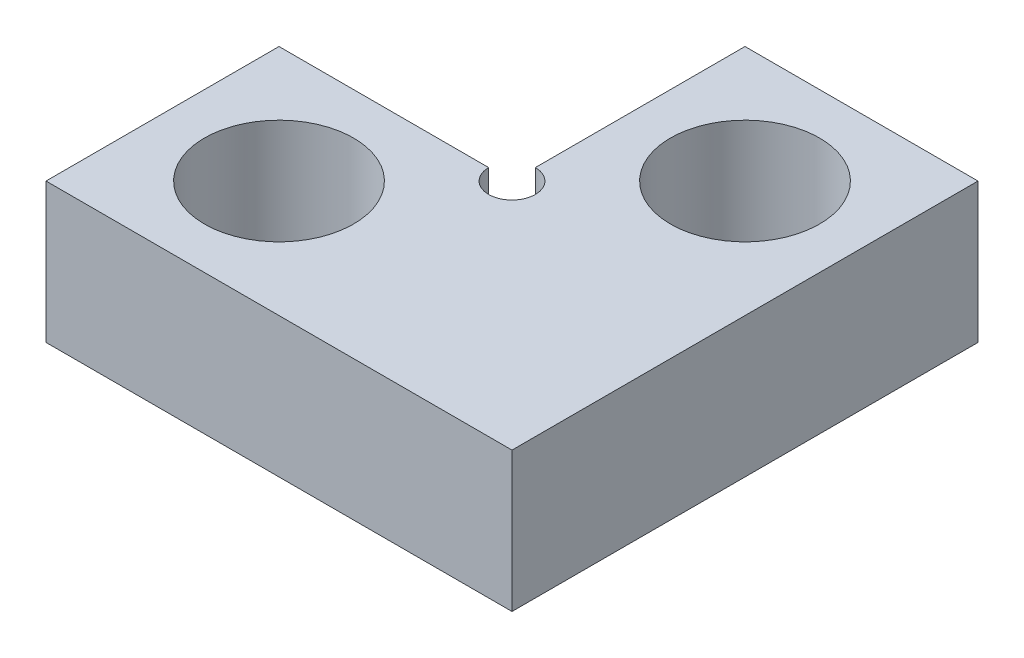
ISO-10303-21;
HEADER;
FILE_DESCRIPTION(('STEP AP214'),'2;1');
FILE_NAME('part.step','',(''),(''),'','','');
FILE_SCHEMA(('AUTOMOTIVE_DESIGN { 1 0 10303 214 1 1 1 1 }'));
ENDSEC;
DATA;
#1=APPLICATION_CONTEXT('core data for automotive mechanical design processes');
#2=APPLICATION_PROTOCOL_DEFINITION('international standard','automotive_design',2000,#1);
#3=PRODUCT_CONTEXT('',#1,'mechanical');
#4=PRODUCT('Part','Part','',(#3));
#5=PRODUCT_RELATED_PRODUCT_CATEGORY('part','',(#4));
#6=PRODUCT_DEFINITION_FORMATION('','',#4);
#7=PRODUCT_DEFINITION_CONTEXT('part definition',#1,'design');
#8=PRODUCT_DEFINITION('design','',#6,#7);
#9=PRODUCT_DEFINITION_SHAPE('','',#8);
#10=(LENGTH_UNIT() NAMED_UNIT(*) SI_UNIT(.MILLI.,.METRE.));
#11=(NAMED_UNIT(*) PLANE_ANGLE_UNIT() SI_UNIT($,.RADIAN.));
#12=(NAMED_UNIT(*) SI_UNIT($,.STERADIAN.) SOLID_ANGLE_UNIT());
#13=UNCERTAINTY_MEASURE_WITH_UNIT(LENGTH_MEASURE(1.E-05),#10,'distance_accuracy_value','');
#14=(GEOMETRIC_REPRESENTATION_CONTEXT(3) GLOBAL_UNCERTAINTY_ASSIGNED_CONTEXT((#13)) GLOBAL_UNIT_ASSIGNED_CONTEXT((#10,
#11,#12)) REPRESENTATION_CONTEXT('',''));
#15=CARTESIAN_POINT('',(0.,0.,0.));
#16=DIRECTION('',(0.,0.,1.));
#17=DIRECTION('',(1.,0.,0.));
#18=AXIS2_PLACEMENT_3D('',#15,#16,#17);
#19=CARTESIAN_POINT('',(0.,3.,0.));
#20=DIRECTION('',(-1.,0.,0.));
#21=DIRECTION('',(0.,0.,1.));
#22=AXIS2_PLACEMENT_3D('',#19,#20,#21);
#23=PLANE('',#22);
#24=DIRECTION('',(0.,0.,-1.));
#25=VECTOR('',#24,1.);
#26=CARTESIAN_POINT('',(0.,0.,0.));
#27=LINE('',#26,#25);
#28=CARTESIAN_POINT('',(0.,0.,-0.5));
#29=VERTEX_POINT('',#28);
#30=CARTESIAN_POINT('',(0.,0.,-5.));
#31=VERTEX_POINT('',#30);
#32=EDGE_CURVE('E130',#29,#31,#27,.T.);
#33=ORIENTED_EDGE('',*,*,#32,.F.);
#34=DIRECTION('',(0.,-1.,0.));
#35=VECTOR('',#34,1.);
#36=CARTESIAN_POINT('',(0.,3.,-0.5));
#37=LINE('',#36,#35);
#38=CARTESIAN_POINT('',(0.,3.,-0.5));
#39=VERTEX_POINT('',#38);
#40=EDGE_CURVE('E11',#39,#29,#37,.T.);
#41=ORIENTED_EDGE('',*,*,#40,.F.);
#42=DIRECTION('',(0.,0.,-1.));
#43=VECTOR('',#42,1.);
#44=CARTESIAN_POINT('',(0.,3.,0.));
#45=LINE('',#44,#43);
#46=CARTESIAN_POINT('',(0.,3.,-5.));
#47=VERTEX_POINT('',#46);
#48=EDGE_CURVE('E168',#39,#47,#45,.T.);
#49=ORIENTED_EDGE('',*,*,#48,.T.);
#50=DIRECTION('',(0.,-1.,0.));
#51=VECTOR('',#50,1.);
#52=CARTESIAN_POINT('',(0.,3.,-5.));
#53=LINE('',#52,#51);
#54=EDGE_CURVE('E52',#47,#31,#53,.T.);
#55=ORIENTED_EDGE('',*,*,#54,.T.);
#56=EDGE_LOOP('',(#33,#41,#49,#55));
#57=FACE_BOUND('',#56,.T.);
#58=ADVANCED_FACE('F35',(#57),#23,.T.);
#59=CARTESIAN_POINT('',(0.,3.,0.));
#60=DIRECTION('',(0.,-1.,0.));
#61=DIRECTION('',(0.,0.,-1.));
#62=AXIS2_PLACEMENT_3D('',#59,#60,#61);
#63=CYLINDRICAL_SURFACE('',#62,0.5);
#64=CARTESIAN_POINT('',(0.,0.,0.));
#65=DIRECTION('',(0.,1.,0.));
#66=DIRECTION('',(0.,0.,1.));
#67=AXIS2_PLACEMENT_3D('',#64,#65,#66);
#68=CIRCLE('',#67,0.5);
#69=CARTESIAN_POINT('',(-0.5,0.,0.));
#70=VERTEX_POINT('',#69);
#71=EDGE_CURVE('E132',#29,#70,#68,.F.);
#72=ORIENTED_EDGE('',*,*,#71,.T.);
#73=DIRECTION('',(0.,-1.,0.));
#74=VECTOR('',#73,1.);
#75=CARTESIAN_POINT('',(-0.5,3.,0.));
#76=LINE('',#75,#74);
#77=CARTESIAN_POINT('',(-0.5,3.,0.));
#78=VERTEX_POINT('',#77);
#79=EDGE_CURVE('E44',#78,#70,#76,.T.);
#80=ORIENTED_EDGE('',*,*,#79,.F.);
#81=CARTESIAN_POINT('',(0.,3.,0.));
#82=DIRECTION('',(0.,1.,0.));
#83=DIRECTION('',(0.,0.,1.));
#84=AXIS2_PLACEMENT_3D('',#81,#82,#83);
#85=CIRCLE('',#84,0.5);
#86=EDGE_CURVE('E166',#39,#78,#85,.F.);
#87=ORIENTED_EDGE('',*,*,#86,.F.);
#88=ORIENTED_EDGE('',*,*,#40,.T.);
#89=EDGE_LOOP('',(#72,#80,#87,#88));
#90=FACE_BOUND('',#89,.T.);
#91=ADVANCED_FACE('F160',(#90),#63,.F.);
#92=CARTESIAN_POINT('',(0.,3.,0.));
#93=DIRECTION('',(0.,0.,-1.));
#94=DIRECTION('',(-1.,0.,0.));
#95=AXIS2_PLACEMENT_3D('',#92,#93,#94);
#96=PLANE('',#95);
#97=DIRECTION('',(1.,0.,0.));
#98=VECTOR('',#97,1.);
#99=CARTESIAN_POINT('',(0.,0.,0.));
#100=LINE('',#99,#98);
#101=CARTESIAN_POINT('',(-5.,0.,0.));
#102=VERTEX_POINT('',#101);
#103=EDGE_CURVE('E135',#102,#70,#100,.T.);
#104=ORIENTED_EDGE('',*,*,#103,.F.);
#105=DIRECTION('',(0.,-1.,0.));
#106=VECTOR('',#105,1.);
#107=CARTESIAN_POINT('',(-5.,3.,0.));
#108=LINE('',#107,#106);
#109=CARTESIAN_POINT('',(-5.,3.,0.));
#110=VERTEX_POINT('',#109);
#111=EDGE_CURVE('E151',#110,#102,#108,.T.);
#112=ORIENTED_EDGE('',*,*,#111,.F.);
#113=DIRECTION('',(1.,0.,0.));
#114=VECTOR('',#113,1.);
#115=CARTESIAN_POINT('',(0.,3.,0.));
#116=LINE('',#115,#114);
#117=EDGE_CURVE('E157',#110,#78,#116,.T.);
#118=ORIENTED_EDGE('',*,*,#117,.T.);
#119=ORIENTED_EDGE('',*,*,#79,.T.);
#120=EDGE_LOOP('',(#104,#112,#118,#119));
#121=FACE_BOUND('',#120,.T.);
#122=ADVANCED_FACE('F156',(#121),#96,.T.);
#123=CARTESIAN_POINT('',(-5.,3.,0.));
#124=DIRECTION('',(-1.,0.,0.));
#125=DIRECTION('',(0.,0.,1.));
#126=AXIS2_PLACEMENT_3D('',#123,#124,#125);
#127=PLANE('',#126);
#128=DIRECTION('',(0.,0.,-1.));
#129=VECTOR('',#128,1.);
#130=CARTESIAN_POINT('',(-5.,0.,0.));
#131=LINE('',#130,#129);
#132=CARTESIAN_POINT('',(-5.,0.,5.));
#133=VERTEX_POINT('',#132);
#134=EDGE_CURVE('E138',#133,#102,#131,.T.);
#135=ORIENTED_EDGE('',*,*,#134,.F.);
#136=DIRECTION('',(0.,-1.,0.));
#137=VECTOR('',#136,1.);
#138=CARTESIAN_POINT('',(-5.,3.,5.));
#139=LINE('',#138,#137);
#140=CARTESIAN_POINT('',(-5.,3.,5.));
#141=VERTEX_POINT('',#140);
#142=EDGE_CURVE('E105',#141,#133,#139,.T.);
#143=ORIENTED_EDGE('',*,*,#142,.F.);
#144=DIRECTION('',(0.,0.,-1.));
#145=VECTOR('',#144,1.);
#146=CARTESIAN_POINT('',(-5.,3.,0.));
#147=LINE('',#146,#145);
#148=EDGE_CURVE('E116',#141,#110,#147,.T.);
#149=ORIENTED_EDGE('',*,*,#148,.T.);
#150=ORIENTED_EDGE('',*,*,#111,.T.);
#151=EDGE_LOOP('',(#135,#143,#149,#150));
#152=FACE_BOUND('',#151,.T.);
#153=ADVANCED_FACE('F165',(#152),#127,.T.);
#154=CARTESIAN_POINT('',(0.,3.,5.));
#155=DIRECTION('',(0.,0.,1.));
#156=DIRECTION('',(1.,0.,0.));
#157=AXIS2_PLACEMENT_3D('',#154,#155,#156);
#158=PLANE('',#157);
#159=DIRECTION('',(-1.,0.,0.));
#160=VECTOR('',#159,1.);
#161=CARTESIAN_POINT('',(0.,0.,5.));
#162=LINE('',#161,#160);
#163=CARTESIAN_POINT('',(5.,0.,5.));
#164=VERTEX_POINT('',#163);
#165=EDGE_CURVE('E101',#164,#133,#162,.T.);
#166=ORIENTED_EDGE('',*,*,#165,.F.);
#167=DIRECTION('',(0.,-1.,0.));
#168=VECTOR('',#167,1.);
#169=CARTESIAN_POINT('',(5.,3.,5.));
#170=LINE('',#169,#168);
#171=CARTESIAN_POINT('',(5.,3.,5.));
#172=VERTEX_POINT('',#171);
#173=EDGE_CURVE('E96',#172,#164,#170,.T.);
#174=ORIENTED_EDGE('',*,*,#173,.F.);
#175=DIRECTION('',(-1.,0.,0.));
#176=VECTOR('',#175,1.);
#177=CARTESIAN_POINT('',(0.,3.,5.));
#178=LINE('',#177,#176);
#179=EDGE_CURVE('E99',#172,#141,#178,.T.);
#180=ORIENTED_EDGE('',*,*,#179,.T.);
#181=ORIENTED_EDGE('',*,*,#142,.T.);
#182=EDGE_LOOP('',(#166,#174,#180,#181));
#183=FACE_BOUND('',#182,.T.);
#184=ADVANCED_FACE('F98',(#183),#158,.T.);
#185=CARTESIAN_POINT('',(5.,3.,0.));
#186=DIRECTION('',(1.,0.,0.));
#187=DIRECTION('',(0.,0.,-1.));
#188=AXIS2_PLACEMENT_3D('',#185,#186,#187);
#189=PLANE('',#188);
#190=DIRECTION('',(0.,0.,1.));
#191=VECTOR('',#190,1.);
#192=CARTESIAN_POINT('',(5.,0.,0.));
#193=LINE('',#192,#191);
#194=CARTESIAN_POINT('',(5.,0.,-5.));
#195=VERTEX_POINT('',#194);
#196=EDGE_CURVE('E142',#195,#164,#193,.T.);
#197=ORIENTED_EDGE('',*,*,#196,.F.);
#198=DIRECTION('',(0.,-1.,0.));
#199=VECTOR('',#198,1.);
#200=CARTESIAN_POINT('',(5.,3.,-5.));
#201=LINE('',#200,#199);
#202=CARTESIAN_POINT('',(5.,3.,-5.));
#203=VERTEX_POINT('',#202);
#204=EDGE_CURVE('E74',#203,#195,#201,.T.);
#205=ORIENTED_EDGE('',*,*,#204,.F.);
#206=DIRECTION('',(0.,0.,1.));
#207=VECTOR('',#206,1.);
#208=CARTESIAN_POINT('',(5.,3.,0.));
#209=LINE('',#208,#207);
#210=EDGE_CURVE('E113',#203,#172,#209,.T.);
#211=ORIENTED_EDGE('',*,*,#210,.T.);
#212=ORIENTED_EDGE('',*,*,#173,.T.);
#213=EDGE_LOOP('',(#197,#205,#211,#212));
#214=FACE_BOUND('',#213,.T.);
#215=ADVANCED_FACE('F118',(#214),#189,.T.);
#216=CARTESIAN_POINT('',(2.5,3.,-2.5));
#217=DIRECTION('',(0.,-1.,0.));
#218=DIRECTION('',(0.,0.,-1.));
#219=AXIS2_PLACEMENT_3D('',#216,#217,#218);
#220=CYLINDRICAL_SURFACE('',#219,1.6);
#221=CARTESIAN_POINT('',(2.5,3.,-2.5));
#222=DIRECTION('',(0.,1.,0.));
#223=DIRECTION('',(0.,0.,1.));
#224=AXIS2_PLACEMENT_3D('',#221,#222,#223);
#225=CIRCLE('',#224,1.6);
#226=CARTESIAN_POINT('',(2.5,3.,-0.9));
#227=VERTEX_POINT('',#226);
#228=EDGE_CURVE('E172',#227,#227,#225,.T.);
#229=ORIENTED_EDGE('',*,*,#228,.T.);
#230=EDGE_LOOP('',(#229));
#231=FACE_BOUND('',#230,.T.);
#232=CARTESIAN_POINT('',(2.5,0.,-2.5));
#233=DIRECTION('',(0.,1.,0.));
#234=DIRECTION('',(0.,0.,1.));
#235=AXIS2_PLACEMENT_3D('',#232,#233,#234);
#236=CIRCLE('',#235,1.6);
#237=CARTESIAN_POINT('',(2.5,0.,-0.9));
#238=VERTEX_POINT('',#237);
#239=EDGE_CURVE('E127',#238,#238,#236,.T.);
#240=ORIENTED_EDGE('',*,*,#239,.F.);
#241=EDGE_LOOP('',(#240));
#242=FACE_BOUND('',#241,.T.);
#243=ADVANCED_FACE('F186',(#231,#242),#220,.F.);
#244=CARTESIAN_POINT('',(-2.5,3.,2.5));
#245=DIRECTION('',(0.,-1.,0.));
#246=DIRECTION('',(0.,0.,-1.));
#247=AXIS2_PLACEMENT_3D('',#244,#245,#246);
#248=CYLINDRICAL_SURFACE('',#247,1.6);
#249=CARTESIAN_POINT('',(-2.5,3.,2.5));
#250=DIRECTION('',(0.,1.,0.));
#251=DIRECTION('',(0.,0.,1.));
#252=AXIS2_PLACEMENT_3D('',#249,#250,#251);
#253=CIRCLE('',#252,1.6);
#254=CARTESIAN_POINT('',(-2.5,3.,4.1));
#255=VERTEX_POINT('',#254);
#256=EDGE_CURVE('E147',#255,#255,#253,.T.);
#257=ORIENTED_EDGE('',*,*,#256,.T.);
#258=EDGE_LOOP('',(#257));
#259=FACE_BOUND('',#258,.T.);
#260=CARTESIAN_POINT('',(-2.5,0.,2.5));
#261=DIRECTION('',(0.,1.,0.));
#262=DIRECTION('',(0.,0.,1.));
#263=AXIS2_PLACEMENT_3D('',#260,#261,#262);
#264=CIRCLE('',#263,1.6);
#265=CARTESIAN_POINT('',(-2.5,0.,4.1));
#266=VERTEX_POINT('',#265);
#267=EDGE_CURVE('E124',#266,#266,#264,.T.);
#268=ORIENTED_EDGE('',*,*,#267,.F.);
#269=EDGE_LOOP('',(#268));
#270=FACE_BOUND('',#269,.T.);
#271=ADVANCED_FACE('F37',(#259,#270),#248,.F.);
#272=CARTESIAN_POINT('',(0.,3.,-5.));
#273=DIRECTION('',(0.,0.,-1.));
#274=DIRECTION('',(-1.,0.,0.));
#275=AXIS2_PLACEMENT_3D('',#272,#273,#274);
#276=PLANE('',#275);
#277=DIRECTION('',(1.,0.,0.));
#278=VECTOR('',#277,1.);
#279=CARTESIAN_POINT('',(0.,0.,-5.));
#280=LINE('',#279,#278);
#281=EDGE_CURVE('E144',#31,#195,#280,.T.);
#282=ORIENTED_EDGE('',*,*,#281,.F.);
#283=ORIENTED_EDGE('',*,*,#54,.F.);
#284=DIRECTION('',(1.,0.,0.));
#285=VECTOR('',#284,1.);
#286=CARTESIAN_POINT('',(0.,3.,-5.));
#287=LINE('',#286,#285);
#288=EDGE_CURVE('E119',#47,#203,#287,.T.);
#289=ORIENTED_EDGE('',*,*,#288,.T.);
#290=ORIENTED_EDGE('',*,*,#204,.T.);
#291=EDGE_LOOP('',(#282,#283,#289,#290));
#292=FACE_BOUND('',#291,.T.);
#293=ADVANCED_FACE('F182',(#292),#276,.T.);
#294=CARTESIAN_POINT('',(0.,3.,0.));
#295=DIRECTION('',(0.,1.,0.));
#296=DIRECTION('',(0.,0.,1.));
#297=AXIS2_PLACEMENT_3D('',#294,#295,#296);
#298=PLANE('',#297);
#299=ORIENTED_EDGE('',*,*,#256,.F.);
#300=EDGE_LOOP('',(#299));
#301=FACE_BOUND('',#300,.T.);
#302=ORIENTED_EDGE('',*,*,#228,.F.);
#303=EDGE_LOOP('',(#302));
#304=FACE_BOUND('',#303,.T.);
#305=ORIENTED_EDGE('',*,*,#48,.F.);
#306=ORIENTED_EDGE('',*,*,#86,.T.);
#307=ORIENTED_EDGE('',*,*,#117,.F.);
#308=ORIENTED_EDGE('',*,*,#148,.F.);
#309=ORIENTED_EDGE('',*,*,#179,.F.);
#310=ORIENTED_EDGE('',*,*,#210,.F.);
#311=ORIENTED_EDGE('',*,*,#288,.F.);
#312=EDGE_LOOP('',(#305,#306,#307,#308,#309,#310,#311));
#313=FACE_BOUND('',#312,.T.);
#314=ADVANCED_FACE('F111',(#301,#304,#313),#298,.T.);
#315=CARTESIAN_POINT('',(0.,0.,0.));
#316=DIRECTION('',(0.,1.,0.));
#317=DIRECTION('',(0.,0.,1.));
#318=AXIS2_PLACEMENT_3D('',#315,#316,#317);
#319=PLANE('',#318);
#320=ORIENTED_EDGE('',*,*,#267,.T.);
#321=EDGE_LOOP('',(#320));
#322=FACE_BOUND('',#321,.T.);
#323=ORIENTED_EDGE('',*,*,#239,.T.);
#324=EDGE_LOOP('',(#323));
#325=FACE_BOUND('',#324,.T.);
#326=ORIENTED_EDGE('',*,*,#32,.T.);
#327=ORIENTED_EDGE('',*,*,#281,.T.);
#328=ORIENTED_EDGE('',*,*,#196,.T.);
#329=ORIENTED_EDGE('',*,*,#165,.T.);
#330=ORIENTED_EDGE('',*,*,#134,.T.);
#331=ORIENTED_EDGE('',*,*,#103,.T.);
#332=ORIENTED_EDGE('',*,*,#71,.F.);
#333=EDGE_LOOP('',(#326,#327,#328,#329,#330,#331,#332));
#334=FACE_BOUND('',#333,.T.);
#335=ADVANCED_FACE('F162',(#322,#325,#334),#319,.F.);
#336=CLOSED_SHELL('',(#58,#91,#122,#153,#184,#215,#243,#271,#293,#314,#335));
#337=MANIFOLD_SOLID_BREP('B2',#336);
#338=ADVANCED_BREP_SHAPE_REPRESENTATION('',(#18,#337),#14);
#339=SHAPE_DEFINITION_REPRESENTATION(#9,#338);
ENDSEC;
END-ISO-10303-21;
